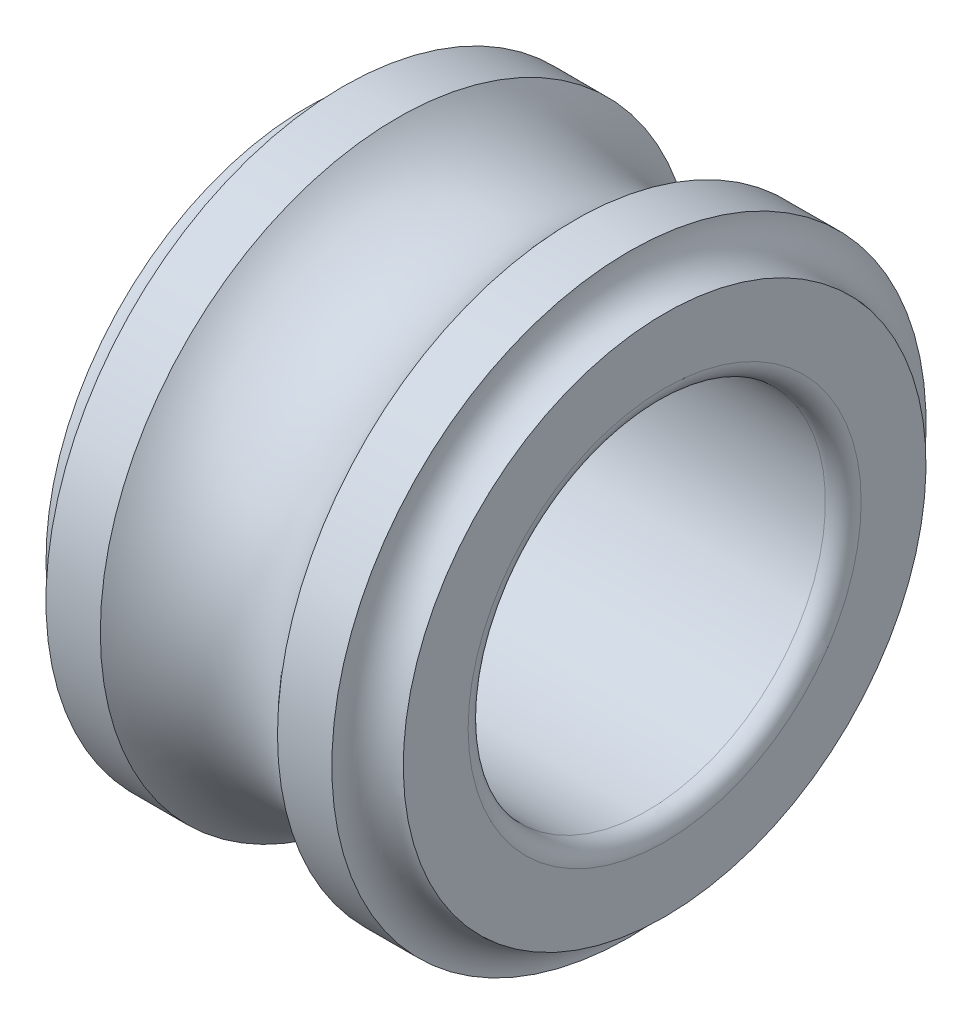
ISO-10303-21;
HEADER;
FILE_DESCRIPTION(('STEP AP214'),'2;1');
FILE_NAME('part.step','',(''),(''),'','','');
FILE_SCHEMA(('AUTOMOTIVE_DESIGN { 1 0 10303 214 1 1 1 1 }'));
ENDSEC;
DATA;
#1=APPLICATION_CONTEXT('core data for automotive mechanical design processes');
#2=APPLICATION_PROTOCOL_DEFINITION('international standard','automotive_design',2000,#1);
#3=PRODUCT_CONTEXT('',#1,'mechanical');
#4=PRODUCT('Part','Part','',(#3));
#5=PRODUCT_RELATED_PRODUCT_CATEGORY('part','',(#4));
#6=PRODUCT_DEFINITION_FORMATION('','',#4);
#7=PRODUCT_DEFINITION_CONTEXT('part definition',#1,'design');
#8=PRODUCT_DEFINITION('design','',#6,#7);
#9=PRODUCT_DEFINITION_SHAPE('','',#8);
#10=(LENGTH_UNIT() NAMED_UNIT(*) SI_UNIT(.MILLI.,.METRE.));
#11=(NAMED_UNIT(*) PLANE_ANGLE_UNIT() SI_UNIT($,.RADIAN.));
#12=(NAMED_UNIT(*) SI_UNIT($,.STERADIAN.) SOLID_ANGLE_UNIT());
#13=UNCERTAINTY_MEASURE_WITH_UNIT(LENGTH_MEASURE(1.E-05),#10,'distance_accuracy_value','');
#14=(GEOMETRIC_REPRESENTATION_CONTEXT(3) GLOBAL_UNCERTAINTY_ASSIGNED_CONTEXT((#13)) GLOBAL_UNIT_ASSIGNED_CONTEXT((#10,
#11,#12)) REPRESENTATION_CONTEXT('',''));
#15=CARTESIAN_POINT('',(0.,0.,0.));
#16=DIRECTION('',(0.,0.,1.));
#17=DIRECTION('',(1.,0.,0.));
#18=AXIS2_PLACEMENT_3D('',#15,#16,#17);
#19=CARTESIAN_POINT('',(3.,0.,0.));
#20=DIRECTION('',(-1.,0.,0.));
#21=DIRECTION('',(0.,-1.,0.));
#22=AXIS2_PLACEMENT_3D('',#19,#20,#21);
#23=CYLINDRICAL_SURFACE('',#22,3.);
#24=CARTESIAN_POINT('',(5.7,0.,0.));
#25=DIRECTION('',(-1.,0.,0.));
#26=DIRECTION('',(0.,0.,1.));
#27=AXIS2_PLACEMENT_3D('',#24,#25,#26);
#28=CIRCLE('',#27,3.);
#29=CARTESIAN_POINT('',(5.7,0.,3.));
#30=VERTEX_POINT('',#29);
#31=EDGE_CURVE('E108',#30,#30,#28,.T.);
#32=ORIENTED_EDGE('',*,*,#31,.F.);
#33=EDGE_LOOP('',(#32));
#34=FACE_BOUND('',#33,.T.);
#35=CARTESIAN_POINT('',(0.3,0.,0.));
#36=DIRECTION('',(-1.,0.,0.));
#37=DIRECTION('',(0.,0.,1.));
#38=AXIS2_PLACEMENT_3D('',#35,#36,#37);
#39=CIRCLE('',#38,3.);
#40=CARTESIAN_POINT('',(0.3,0.,3.));
#41=VERTEX_POINT('',#40);
#42=EDGE_CURVE('E88',#41,#41,#39,.F.);
#43=ORIENTED_EDGE('',*,*,#42,.F.);
#44=EDGE_LOOP('',(#43));
#45=FACE_BOUND('',#44,.T.);
#46=ADVANCED_FACE('F16',(#34,#45),#23,.F.);
#47=CARTESIAN_POINT('',(5.7,0.,0.));
#48=DIRECTION('',(-1.,0.,0.));
#49=DIRECTION('',(0.,0.,1.));
#50=AXIS2_PLACEMENT_3D('',#47,#48,#49);
#51=TOROIDAL_SURFACE('',#50,3.3,0.300000000000001);
#52=ORIENTED_EDGE('',*,*,#31,.T.);
#53=EDGE_LOOP('',(#52));
#54=FACE_BOUND('',#53,.T.);
#55=CARTESIAN_POINT('',(6.,0.,0.));
#56=DIRECTION('',(1.,0.,0.));
#57=DIRECTION('',(0.,0.,-1.));
#58=AXIS2_PLACEMENT_3D('',#55,#56,#57);
#59=CIRCLE('',#58,3.3);
#60=CARTESIAN_POINT('',(6.,0.,-3.3));
#61=VERTEX_POINT('',#60);
#62=EDGE_CURVE('E77',#61,#61,#59,.F.);
#63=ORIENTED_EDGE('',*,*,#62,.F.);
#64=EDGE_LOOP('',(#63));
#65=FACE_BOUND('',#64,.T.);
#66=ADVANCED_FACE('F93',(#54,#65),#51,.T.);
#67=CARTESIAN_POINT('',(0.299999999999999,0.,0.));
#68=DIRECTION('',(-1.,0.,0.));
#69=DIRECTION('',(0.,0.,1.));
#70=AXIS2_PLACEMENT_3D('',#67,#68,#69);
#71=TOROIDAL_SURFACE('',#70,3.3,0.3);
#72=CARTESIAN_POINT('',(0.,0.,0.));
#73=DIRECTION('',(-1.,0.,0.));
#74=DIRECTION('',(0.,0.,-1.));
#75=AXIS2_PLACEMENT_3D('',#72,#73,#74);
#76=CIRCLE('',#75,3.3);
#77=CARTESIAN_POINT('',(0.,0.,-3.3));
#78=VERTEX_POINT('',#77);
#79=EDGE_CURVE('E124',#78,#78,#76,.F.);
#80=ORIENTED_EDGE('',*,*,#79,.F.);
#81=EDGE_LOOP('',(#80));
#82=FACE_BOUND('',#81,.T.);
#83=ORIENTED_EDGE('',*,*,#42,.T.);
#84=EDGE_LOOP('',(#83));
#85=FACE_BOUND('',#84,.T.);
#86=ADVANCED_FACE('F90',(#82,#85),#71,.T.);
#87=CARTESIAN_POINT('',(6.,3.8445,0.));
#88=DIRECTION('',(1.,0.,0.));
#89=DIRECTION('',(0.,1.,0.));
#90=AXIS2_PLACEMENT_3D('',#87,#88,#89);
#91=PLANE('',#90);
#92=ORIENTED_EDGE('',*,*,#62,.T.);
#93=EDGE_LOOP('',(#92));
#94=FACE_BOUND('',#93,.T.);
#95=CARTESIAN_POINT('',(6.,0.,0.));
#96=DIRECTION('',(-1.,0.,0.));
#97=DIRECTION('',(0.,-1.,0.));
#98=AXIS2_PLACEMENT_3D('',#95,#96,#97);
#99=CIRCLE('',#98,4.389);
#100=CARTESIAN_POINT('',(6.,-4.389,0.));
#101=VERTEX_POINT('',#100);
#102=EDGE_CURVE('E19',#101,#101,#99,.F.);
#103=ORIENTED_EDGE('',*,*,#102,.T.);
#104=EDGE_LOOP('',(#103));
#105=FACE_BOUND('',#104,.T.);
#106=ADVANCED_FACE('F59',(#94,#105),#91,.T.);
#107=CARTESIAN_POINT('',(0.,3.8445,0.));
#108=DIRECTION('',(-1.,0.,0.));
#109=DIRECTION('',(0.,0.,1.));
#110=AXIS2_PLACEMENT_3D('',#107,#108,#109);
#111=PLANE('',#110);
#112=ORIENTED_EDGE('',*,*,#79,.T.);
#113=EDGE_LOOP('',(#112));
#114=FACE_BOUND('',#113,.T.);
#115=CARTESIAN_POINT('',(0.,0.,0.));
#116=DIRECTION('',(-1.,0.,0.));
#117=DIRECTION('',(0.,-1.,0.));
#118=AXIS2_PLACEMENT_3D('',#115,#116,#117);
#119=CIRCLE('',#118,4.389);
#120=CARTESIAN_POINT('',(0.,-4.389,0.));
#121=VERTEX_POINT('',#120);
#122=EDGE_CURVE('E38',#121,#121,#119,.T.);
#123=ORIENTED_EDGE('',*,*,#122,.T.);
#124=EDGE_LOOP('',(#123));
#125=FACE_BOUND('',#124,.T.);
#126=ADVANCED_FACE('F54',(#114,#125),#111,.T.);
#127=CARTESIAN_POINT('',(6.,0.,0.));
#128=DIRECTION('',(-1.,0.,0.));
#129=DIRECTION('',(0.,0.,1.));
#130=AXIS2_PLACEMENT_3D('',#127,#128,#129);
#131=TOROIDAL_SURFACE('',#130,4.989,0.600000000000001);
#132=ORIENTED_EDGE('',*,*,#102,.F.);
#133=EDGE_LOOP('',(#132));
#134=FACE_BOUND('',#133,.T.);
#135=CARTESIAN_POINT('',(5.4,0.,0.));
#136=DIRECTION('',(-1.,0.,0.));
#137=DIRECTION('',(0.,-1.,0.));
#138=AXIS2_PLACEMENT_3D('',#135,#136,#137);
#139=CIRCLE('',#138,4.989);
#140=CARTESIAN_POINT('',(5.4,-4.989,0.));
#141=VERTEX_POINT('',#140);
#142=EDGE_CURVE('E35',#141,#141,#139,.T.);
#143=ORIENTED_EDGE('',*,*,#142,.F.);
#144=EDGE_LOOP('',(#143));
#145=FACE_BOUND('',#144,.T.);
#146=ADVANCED_FACE('F49',(#134,#145),#131,.F.);
#147=CARTESIAN_POINT('',(0.,0.,0.));
#148=DIRECTION('',(-1.,0.,0.));
#149=DIRECTION('',(0.,0.,1.));
#150=AXIS2_PLACEMENT_3D('',#147,#148,#149);
#151=TOROIDAL_SURFACE('',#150,4.989,0.600000000000001);
#152=CARTESIAN_POINT('',(0.6,0.,0.));
#153=DIRECTION('',(-1.,0.,0.));
#154=DIRECTION('',(0.,-1.,0.));
#155=AXIS2_PLACEMENT_3D('',#152,#153,#154);
#156=CIRCLE('',#155,4.989);
#157=CARTESIAN_POINT('',(0.599999999999999,-4.989,0.));
#158=VERTEX_POINT('',#157);
#159=EDGE_CURVE('E28',#158,#158,#156,.F.);
#160=ORIENTED_EDGE('',*,*,#159,.F.);
#161=EDGE_LOOP('',(#160));
#162=FACE_BOUND('',#161,.T.);
#163=ORIENTED_EDGE('',*,*,#122,.F.);
#164=EDGE_LOOP('',(#163));
#165=FACE_BOUND('',#164,.T.);
#166=ADVANCED_FACE('F44',(#162,#165),#151,.F.);
#167=CARTESIAN_POINT('',(4.94370340190159,0.,0.));
#168=DIRECTION('',(-1.,0.,0.));
#169=DIRECTION('',(0.,-1.,0.));
#170=AXIS2_PLACEMENT_3D('',#167,#168,#169);
#171=CYLINDRICAL_SURFACE('',#170,4.989);
#172=ORIENTED_EDGE('',*,*,#142,.T.);
#173=EDGE_LOOP('',(#172));
#174=FACE_BOUND('',#173,.T.);
#175=CARTESIAN_POINT('',(4.48740680380318,0.,0.));
#176=DIRECTION('',(-1.,0.,0.));
#177=DIRECTION('',(0.,0.,1.));
#178=AXIS2_PLACEMENT_3D('',#175,#176,#177);
#179=CIRCLE('',#178,4.989);
#180=CARTESIAN_POINT('',(4.48740680380318,0.,4.989));
#181=VERTEX_POINT('',#180);
#182=EDGE_CURVE('E23',#181,#181,#179,.F.);
#183=ORIENTED_EDGE('',*,*,#182,.T.);
#184=EDGE_LOOP('',(#183));
#185=FACE_BOUND('',#184,.T.);
#186=ADVANCED_FACE('F48',(#174,#185),#171,.T.);
#187=CARTESIAN_POINT('',(1.05629659809841,0.,0.));
#188=DIRECTION('',(-1.,0.,0.));
#189=DIRECTION('',(0.,-1.,0.));
#190=AXIS2_PLACEMENT_3D('',#187,#188,#189);
#191=CYLINDRICAL_SURFACE('',#190,4.989);
#192=ORIENTED_EDGE('',*,*,#159,.T.);
#193=EDGE_LOOP('',(#192));
#194=FACE_BOUND('',#193,.T.);
#195=CARTESIAN_POINT('',(1.51259319619682,0.,0.));
#196=DIRECTION('',(-1.,0.,0.));
#197=DIRECTION('',(0.,0.,1.));
#198=AXIS2_PLACEMENT_3D('',#195,#196,#197);
#199=CIRCLE('',#198,4.989);
#200=CARTESIAN_POINT('',(1.51259319619682,0.,4.989));
#201=VERTEX_POINT('',#200);
#202=EDGE_CURVE('E10',#201,#201,#199,.T.);
#203=ORIENTED_EDGE('',*,*,#202,.T.);
#204=EDGE_LOOP('',(#203));
#205=FACE_BOUND('',#204,.T.);
#206=ADVANCED_FACE('F141',(#194,#205),#191,.T.);
#207=CARTESIAN_POINT('',(3.,0.,0.));
#208=DIRECTION('',(-1.,0.,0.));
#209=DIRECTION('',(0.,0.,1.));
#210=AXIS2_PLACEMENT_3D('',#207,#208,#209);
#211=TOROIDAL_SURFACE('',#210,6.25,1.95);
#212=ORIENTED_EDGE('',*,*,#202,.F.);
#213=EDGE_LOOP('',(#212));
#214=FACE_BOUND('',#213,.T.);
#215=ORIENTED_EDGE('',*,*,#182,.F.);
#216=EDGE_LOOP('',(#215));
#217=FACE_BOUND('',#216,.T.);
#218=ADVANCED_FACE('F139',(#214,#217),#211,.F.);
#219=CLOSED_SHELL('',(#46,#66,#86,#106,#126,#146,#166,#186,#206,#218));
#220=MANIFOLD_SOLID_BREP('B1',#219);
#221=ADVANCED_BREP_SHAPE_REPRESENTATION('',(#18,#220),#14);
#222=SHAPE_DEFINITION_REPRESENTATION(#9,#221);
ENDSEC;
END-ISO-10303-21;
